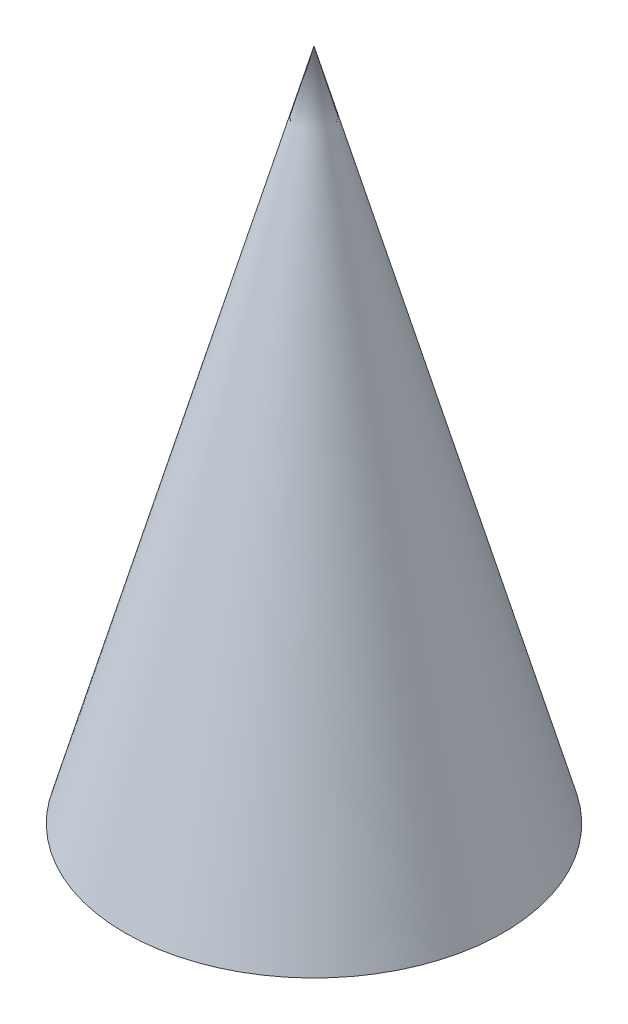
ISO-10303-21;
HEADER;
FILE_DESCRIPTION(('STEP AP214'),'2;1');
FILE_NAME('part.step','',(''),(''),'','','');
FILE_SCHEMA(('AUTOMOTIVE_DESIGN { 1 0 10303 214 1 1 1 1 }'));
ENDSEC;
DATA;
#1=APPLICATION_CONTEXT('core data for automotive mechanical design processes');
#2=APPLICATION_PROTOCOL_DEFINITION('international standard','automotive_design',2000,#1);
#3=PRODUCT_CONTEXT('',#1,'mechanical');
#4=PRODUCT('Part','Part','',(#3));
#5=PRODUCT_RELATED_PRODUCT_CATEGORY('part','',(#4));
#6=PRODUCT_DEFINITION_FORMATION('','',#4);
#7=PRODUCT_DEFINITION_CONTEXT('part definition',#1,'design');
#8=PRODUCT_DEFINITION('design','',#6,#7);
#9=PRODUCT_DEFINITION_SHAPE('','',#8);
#10=(LENGTH_UNIT() NAMED_UNIT(*) SI_UNIT(.MILLI.,.METRE.));
#11=(NAMED_UNIT(*) PLANE_ANGLE_UNIT() SI_UNIT($,.RADIAN.));
#12=(NAMED_UNIT(*) SI_UNIT($,.STERADIAN.) SOLID_ANGLE_UNIT());
#13=UNCERTAINTY_MEASURE_WITH_UNIT(LENGTH_MEASURE(1.E-05),#10,'distance_accuracy_value','');
#14=(GEOMETRIC_REPRESENTATION_CONTEXT(3) GLOBAL_UNCERTAINTY_ASSIGNED_CONTEXT((#13)) GLOBAL_UNIT_ASSIGNED_CONTEXT((#10,
#11,#12)) REPRESENTATION_CONTEXT('',''));
#15=CARTESIAN_POINT('',(0.,0.,0.));
#16=DIRECTION('',(0.,0.,1.));
#17=DIRECTION('',(1.,0.,0.));
#18=AXIS2_PLACEMENT_3D('',#15,#16,#17);
#19=CARTESIAN_POINT('',(0.,271.755588020763,0.));
#20=DIRECTION('',(0.,-1.,0.));
#21=DIRECTION('',(0.,0.,-1.));
#22=AXIS2_PLACEMENT_3D('',#19,#20,#21);
#23=PLANE('',#22);
#24=CARTESIAN_POINT('',(0.,271.755588020763,0.));
#25=DIRECTION('',(0.,-1.,0.));
#26=DIRECTION('',(0.,0.,-1.));
#27=AXIS2_PLACEMENT_3D('',#24,#25,#26);
#28=CIRCLE('',#27,2.5);
#29=CARTESIAN_POINT('',(0.,271.755588020763,-2.5));
#30=VERTEX_POINT('',#29);
#31=EDGE_CURVE('E48',#30,#30,#28,.T.);
#32=ORIENTED_EDGE('',*,*,#31,.F.);
#33=EDGE_LOOP('',(#32));
#34=FACE_BOUND('',#33,.T.);
#35=CARTESIAN_POINT('',(0.,271.755588020763,0.));
#36=DIRECTION('',(0.,-1.,0.));
#37=DIRECTION('',(0.,0.,-1.));
#38=AXIS2_PLACEMENT_3D('',#35,#36,#37);
#39=CIRCLE('',#38,13.9612217644098);
#40=CARTESIAN_POINT('',(0.,271.755588020763,-13.9612217644098));
#41=VERTEX_POINT('',#40);
#42=EDGE_CURVE('E76',#41,#41,#39,.T.);
#43=ORIENTED_EDGE('',*,*,#42,.T.);
#44=EDGE_LOOP('',(#43));
#45=FACE_BOUND('',#44,.T.);
#46=ADVANCED_FACE('F45',(#34,#45),#23,.T.);
#47=CARTESIAN_POINT('',(0.,291.755588020763,0.));
#48=DIRECTION('',(0.,-1.,0.));
#49=DIRECTION('',(0.,0.,-1.));
#50=AXIS2_PLACEMENT_3D('',#47,#48,#49);
#51=CYLINDRICAL_SURFACE('',#50,2.5);
#52=CARTESIAN_POINT('',(0.,291.755588020763,0.));
#53=DIRECTION('',(0.,-1.,0.));
#54=DIRECTION('',(0.,0.,-1.));
#55=AXIS2_PLACEMENT_3D('',#52,#53,#54);
#56=CIRCLE('',#55,2.5);
#57=CARTESIAN_POINT('',(0.,291.755588020763,-2.5));
#58=VERTEX_POINT('',#57);
#59=EDGE_CURVE('E11',#58,#58,#56,.T.);
#60=ORIENTED_EDGE('',*,*,#59,.F.);
#61=EDGE_LOOP('',(#60));
#62=FACE_BOUND('',#61,.T.);
#63=ORIENTED_EDGE('',*,*,#31,.T.);
#64=EDGE_LOOP('',(#63));
#65=FACE_BOUND('',#64,.T.);
#66=ADVANCED_FACE('F62',(#62,#65),#51,.F.);
#67=CARTESIAN_POINT('',(0.,291.755588020763,0.));
#68=DIRECTION('',(0.,-1.,0.));
#69=DIRECTION('',(0.,0.,-1.));
#70=AXIS2_PLACEMENT_3D('',#67,#68,#69);
#71=PLANE('',#70);
#72=ORIENTED_EDGE('',*,*,#59,.T.);
#73=EDGE_LOOP('',(#72));
#74=FACE_BOUND('',#73,.T.);
#75=ADVANCED_FACE('F56',(#74),#71,.T.);
#76=CARTESIAN_POINT('',(0.,321.408464023832,0.));
#77=DIRECTION('',(0.,-1.,0.));
#78=DIRECTION('',(0.,0.,-1.));
#79=AXIS2_PLACEMENT_3D('',#76,#77,#78);
#80=CONICAL_SURFACE('',#79,0.,0.274099335263468);
#81=ORIENTED_EDGE('',*,*,#42,.F.);
#82=EDGE_LOOP('',(#81));
#83=FACE_BOUND('',#82,.T.);
#84=CARTESIAN_POINT('',(0.,321.408464023832,0.));
#85=VERTEX_POINT('',#84);
#86=VERTEX_LOOP('',#85);
#87=FACE_BOUND('',#86,.T.);
#88=ADVANCED_FACE('F54',(#83,#87),#80,.T.);
#89=CLOSED_SHELL('',(#46,#66,#75,#88));
#90=MANIFOLD_SOLID_BREP('B2',#89);
#91=ADVANCED_BREP_SHAPE_REPRESENTATION('',(#18,#90),#14);
#92=SHAPE_DEFINITION_REPRESENTATION(#9,#91);
ENDSEC;
END-ISO-10303-21;
